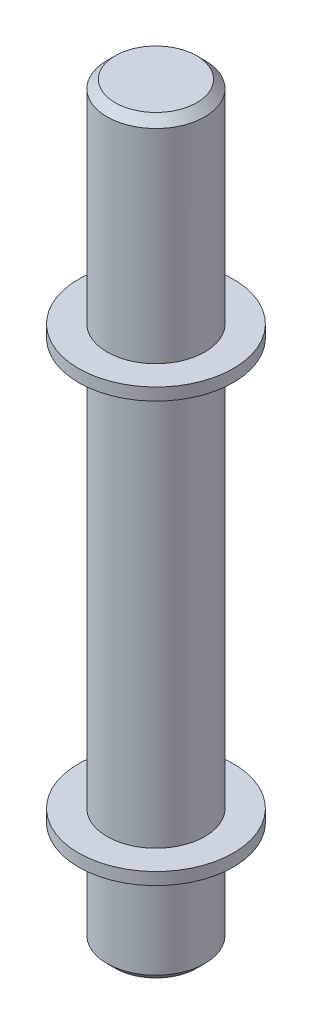
ISO-10303-21;
HEADER;
FILE_DESCRIPTION(('STEP AP214'),'2;1');
FILE_NAME('part.step','',(''),(''),'','','');
FILE_SCHEMA(('AUTOMOTIVE_DESIGN { 1 0 10303 214 1 1 1 1 }'));
ENDSEC;
DATA;
#1=APPLICATION_CONTEXT('core data for automotive mechanical design processes');
#2=APPLICATION_PROTOCOL_DEFINITION('international standard','automotive_design',2000,#1);
#3=PRODUCT_CONTEXT('',#1,'mechanical');
#4=PRODUCT('Part','Part','',(#3));
#5=PRODUCT_RELATED_PRODUCT_CATEGORY('part','',(#4));
#6=PRODUCT_DEFINITION_FORMATION('','',#4);
#7=PRODUCT_DEFINITION_CONTEXT('part definition',#1,'design');
#8=PRODUCT_DEFINITION('design','',#6,#7);
#9=PRODUCT_DEFINITION_SHAPE('','',#8);
#10=(LENGTH_UNIT() NAMED_UNIT(*) SI_UNIT(.MILLI.,.METRE.));
#11=(NAMED_UNIT(*) PLANE_ANGLE_UNIT() SI_UNIT($,.RADIAN.));
#12=(NAMED_UNIT(*) SI_UNIT($,.STERADIAN.) SOLID_ANGLE_UNIT());
#13=UNCERTAINTY_MEASURE_WITH_UNIT(LENGTH_MEASURE(1.E-05),#10,'distance_accuracy_value','');
#14=(GEOMETRIC_REPRESENTATION_CONTEXT(3) GLOBAL_UNCERTAINTY_ASSIGNED_CONTEXT((#13)) GLOBAL_UNIT_ASSIGNED_CONTEXT((#10,
#11,#12)) REPRESENTATION_CONTEXT('',''));
#15=CARTESIAN_POINT('',(0.,0.,0.));
#16=DIRECTION('',(0.,0.,1.));
#17=DIRECTION('',(1.,0.,0.));
#18=AXIS2_PLACEMENT_3D('',#15,#16,#17);
#19=CARTESIAN_POINT('',(0.,0.,0.));
#20=DIRECTION('',(0.,1.,0.));
#21=DIRECTION('',(0.,0.,1.));
#22=AXIS2_PLACEMENT_3D('',#19,#20,#21);
#23=PLANE('',#22);
#24=CARTESIAN_POINT('',(0.,0.,0.));
#25=DIRECTION('',(0.,1.,0.));
#26=DIRECTION('',(0.,0.,1.));
#27=AXIS2_PLACEMENT_3D('',#24,#25,#26);
#28=CIRCLE('',#27,10.);
#29=CARTESIAN_POINT('',(0.,0.,10.));
#30=VERTEX_POINT('',#29);
#31=EDGE_CURVE('E45',#30,#30,#28,.F.);
#32=ORIENTED_EDGE('',*,*,#31,.T.);
#33=EDGE_LOOP('',(#32));
#34=FACE_BOUND('',#33,.T.);
#35=ADVANCED_FACE('F34',(#34),#23,.F.);
#36=CARTESIAN_POINT('',(0.,29.7776081352658,0.));
#37=DIRECTION('',(0.,1.,0.));
#38=DIRECTION('',(0.,0.,1.));
#39=AXIS2_PLACEMENT_3D('',#36,#37,#38);
#40=CYLINDRICAL_SURFACE('',#39,12.);
#41=CARTESIAN_POINT('',(0.,1.99999999999998,0.));
#42=DIRECTION('',(0.,1.,0.));
#43=DIRECTION('',(0.,0.,1.));
#44=AXIS2_PLACEMENT_3D('',#41,#42,#43);
#45=CIRCLE('',#44,12.);
#46=CARTESIAN_POINT('',(0.,1.99999999999998,12.));
#47=VERTEX_POINT('',#46);
#48=EDGE_CURVE('E49',#47,#47,#45,.T.);
#49=ORIENTED_EDGE('',*,*,#48,.T.);
#50=EDGE_LOOP('',(#49));
#51=FACE_BOUND('',#50,.T.);
#52=CARTESIAN_POINT('',(0.,26.,0.));
#53=DIRECTION('',(0.,1.,0.));
#54=DIRECTION('',(0.,0.,1.));
#55=AXIS2_PLACEMENT_3D('',#52,#53,#54);
#56=CIRCLE('',#55,12.);
#57=CARTESIAN_POINT('',(0.,26.,12.));
#58=VERTEX_POINT('',#57);
#59=EDGE_CURVE('E54',#58,#58,#56,.T.);
#60=ORIENTED_EDGE('',*,*,#59,.F.);
#61=EDGE_LOOP('',(#60));
#62=FACE_BOUND('',#61,.T.);
#63=ADVANCED_FACE('F120',(#51,#62),#40,.T.);
#64=CARTESIAN_POINT('',(0.,26.,-12.));
#65=DIRECTION('',(0.,1.,0.));
#66=DIRECTION('',(0.,0.,1.));
#67=AXIS2_PLACEMENT_3D('',#64,#65,#66);
#68=PLANE('',#67);
#69=CARTESIAN_POINT('',(0.,26.,0.));
#70=DIRECTION('',(0.,1.,0.));
#71=DIRECTION('',(0.,0.,1.));
#72=AXIS2_PLACEMENT_3D('',#69,#70,#71);
#73=CIRCLE('',#72,19.);
#74=CARTESIAN_POINT('',(0.,26.,19.));
#75=VERTEX_POINT('',#74);
#76=EDGE_CURVE('E57',#75,#75,#73,.T.);
#77=ORIENTED_EDGE('',*,*,#76,.F.);
#78=EDGE_LOOP('',(#77));
#79=FACE_BOUND('',#78,.T.);
#80=ORIENTED_EDGE('',*,*,#59,.T.);
#81=EDGE_LOOP('',(#80));
#82=FACE_BOUND('',#81,.T.);
#83=ADVANCED_FACE('F114',(#79,#82),#68,.F.);
#84=CARTESIAN_POINT('',(0.,29.7776081352658,0.));
#85=DIRECTION('',(0.,1.,0.));
#86=DIRECTION('',(0.,0.,1.));
#87=AXIS2_PLACEMENT_3D('',#84,#85,#86);
#88=CYLINDRICAL_SURFACE('',#87,19.);
#89=CARTESIAN_POINT('',(0.,29.,0.));
#90=DIRECTION('',(0.,1.,0.));
#91=DIRECTION('',(0.,0.,1.));
#92=AXIS2_PLACEMENT_3D('',#89,#90,#91);
#93=CIRCLE('',#92,19.);
#94=CARTESIAN_POINT('',(0.,29.,19.));
#95=VERTEX_POINT('',#94);
#96=EDGE_CURVE('E60',#95,#95,#93,.T.);
#97=ORIENTED_EDGE('',*,*,#96,.F.);
#98=EDGE_LOOP('',(#97));
#99=FACE_BOUND('',#98,.T.);
#100=ORIENTED_EDGE('',*,*,#76,.T.);
#101=EDGE_LOOP('',(#100));
#102=FACE_BOUND('',#101,.T.);
#103=ADVANCED_FACE('F108',(#99,#102),#88,.T.);
#104=CARTESIAN_POINT('',(0.,29.,-19.));
#105=DIRECTION('',(0.,-1.,0.));
#106=DIRECTION('',(0.,0.,-1.));
#107=AXIS2_PLACEMENT_3D('',#104,#105,#106);
#108=PLANE('',#107);
#109=CARTESIAN_POINT('',(0.,29.,0.));
#110=DIRECTION('',(0.,1.,0.));
#111=DIRECTION('',(0.,0.,1.));
#112=AXIS2_PLACEMENT_3D('',#109,#110,#111);
#113=CIRCLE('',#112,12.);
#114=CARTESIAN_POINT('',(0.,29.,12.));
#115=VERTEX_POINT('',#114);
#116=EDGE_CURVE('E63',#115,#115,#113,.T.);
#117=ORIENTED_EDGE('',*,*,#116,.F.);
#118=EDGE_LOOP('',(#117));
#119=FACE_BOUND('',#118,.T.);
#120=ORIENTED_EDGE('',*,*,#96,.T.);
#121=EDGE_LOOP('',(#120));
#122=FACE_BOUND('',#121,.T.);
#123=ADVANCED_FACE('F102',(#119,#122),#108,.F.);
#124=CARTESIAN_POINT('',(0.,29.7776081352658,0.));
#125=DIRECTION('',(0.,1.,0.));
#126=DIRECTION('',(0.,0.,1.));
#127=AXIS2_PLACEMENT_3D('',#124,#125,#126);
#128=CYLINDRICAL_SURFACE('',#127,12.);
#129=CARTESIAN_POINT('',(0.,129.,0.));
#130=DIRECTION('',(0.,1.,0.));
#131=DIRECTION('',(0.,0.,1.));
#132=AXIS2_PLACEMENT_3D('',#129,#130,#131);
#133=CIRCLE('',#132,12.);
#134=CARTESIAN_POINT('',(0.,129.,12.));
#135=VERTEX_POINT('',#134);
#136=EDGE_CURVE('E66',#135,#135,#133,.T.);
#137=ORIENTED_EDGE('',*,*,#136,.F.);
#138=EDGE_LOOP('',(#137));
#139=FACE_BOUND('',#138,.T.);
#140=ORIENTED_EDGE('',*,*,#116,.T.);
#141=EDGE_LOOP('',(#140));
#142=FACE_BOUND('',#141,.T.);
#143=ADVANCED_FACE('F96',(#139,#142),#128,.T.);
#144=CARTESIAN_POINT('',(0.,129.,-12.));
#145=DIRECTION('',(0.,1.,0.));
#146=DIRECTION('',(0.,0.,1.));
#147=AXIS2_PLACEMENT_3D('',#144,#145,#146);
#148=PLANE('',#147);
#149=CARTESIAN_POINT('',(0.,129.,0.));
#150=DIRECTION('',(0.,1.,0.));
#151=DIRECTION('',(0.,0.,1.));
#152=AXIS2_PLACEMENT_3D('',#149,#150,#151);
#153=CIRCLE('',#152,19.);
#154=CARTESIAN_POINT('',(0.,129.,19.));
#155=VERTEX_POINT('',#154);
#156=EDGE_CURVE('E69',#155,#155,#153,.T.);
#157=ORIENTED_EDGE('',*,*,#156,.F.);
#158=EDGE_LOOP('',(#157));
#159=FACE_BOUND('',#158,.T.);
#160=ORIENTED_EDGE('',*,*,#136,.T.);
#161=EDGE_LOOP('',(#160));
#162=FACE_BOUND('',#161,.T.);
#163=ADVANCED_FACE('F90',(#159,#162),#148,.F.);
#164=CARTESIAN_POINT('',(0.,29.7776081352658,0.));
#165=DIRECTION('',(0.,1.,0.));
#166=DIRECTION('',(0.,0.,1.));
#167=AXIS2_PLACEMENT_3D('',#164,#165,#166);
#168=CYLINDRICAL_SURFACE('',#167,19.);
#169=CARTESIAN_POINT('',(0.,132.,0.));
#170=DIRECTION('',(0.,1.,0.));
#171=DIRECTION('',(0.,0.,1.));
#172=AXIS2_PLACEMENT_3D('',#169,#170,#171);
#173=CIRCLE('',#172,19.);
#174=CARTESIAN_POINT('',(0.,132.,19.));
#175=VERTEX_POINT('',#174);
#176=EDGE_CURVE('E72',#175,#175,#173,.T.);
#177=ORIENTED_EDGE('',*,*,#176,.F.);
#178=EDGE_LOOP('',(#177));
#179=FACE_BOUND('',#178,.T.);
#180=ORIENTED_EDGE('',*,*,#156,.T.);
#181=EDGE_LOOP('',(#180));
#182=FACE_BOUND('',#181,.T.);
#183=ADVANCED_FACE('F84',(#179,#182),#168,.T.);
#184=CARTESIAN_POINT('',(0.,132.,-19.));
#185=DIRECTION('',(0.,-1.,0.));
#186=DIRECTION('',(0.,0.,-1.));
#187=AXIS2_PLACEMENT_3D('',#184,#185,#186);
#188=PLANE('',#187);
#189=CARTESIAN_POINT('',(0.,132.,0.));
#190=DIRECTION('',(0.,1.,0.));
#191=DIRECTION('',(0.,0.,1.));
#192=AXIS2_PLACEMENT_3D('',#189,#190,#191);
#193=CIRCLE('',#192,12.);
#194=CARTESIAN_POINT('',(0.,132.,12.));
#195=VERTEX_POINT('',#194);
#196=EDGE_CURVE('E75',#195,#195,#193,.T.);
#197=ORIENTED_EDGE('',*,*,#196,.F.);
#198=EDGE_LOOP('',(#197));
#199=FACE_BOUND('',#198,.T.);
#200=ORIENTED_EDGE('',*,*,#176,.T.);
#201=EDGE_LOOP('',(#200));
#202=FACE_BOUND('',#201,.T.);
#203=ADVANCED_FACE('F81',(#199,#202),#188,.F.);
#204=CARTESIAN_POINT('',(0.,29.7776081352658,0.));
#205=DIRECTION('',(0.,1.,0.));
#206=DIRECTION('',(0.,0.,1.));
#207=AXIS2_PLACEMENT_3D('',#204,#205,#206);
#208=CYLINDRICAL_SURFACE('',#207,12.);
#209=CARTESIAN_POINT('',(0.,182.,0.));
#210=DIRECTION('',(0.,-1.,0.));
#211=DIRECTION('',(0.,0.,-1.));
#212=AXIS2_PLACEMENT_3D('',#209,#210,#211);
#213=CIRCLE('',#212,12.);
#214=CARTESIAN_POINT('',(0.,182.,-12.));
#215=VERTEX_POINT('',#214);
#216=EDGE_CURVE('E10',#215,#215,#213,.T.);
#217=ORIENTED_EDGE('',*,*,#216,.T.);
#218=EDGE_LOOP('',(#217));
#219=FACE_BOUND('',#218,.T.);
#220=ORIENTED_EDGE('',*,*,#196,.T.);
#221=EDGE_LOOP('',(#220));
#222=FACE_BOUND('',#221,.T.);
#223=ADVANCED_FACE('F79',(#219,#222),#208,.T.);
#224=CARTESIAN_POINT('',(0.,184.,-12.));
#225=DIRECTION('',(0.,-1.,0.));
#226=DIRECTION('',(0.,0.,-1.));
#227=AXIS2_PLACEMENT_3D('',#224,#225,#226);
#228=PLANE('',#227);
#229=CARTESIAN_POINT('',(0.,184.,0.));
#230=DIRECTION('',(0.,-1.,0.));
#231=DIRECTION('',(0.,0.,-1.));
#232=AXIS2_PLACEMENT_3D('',#229,#230,#231);
#233=CIRCLE('',#232,9.99999999999998);
#234=CARTESIAN_POINT('',(0.,184.,-9.99999999999998));
#235=VERTEX_POINT('',#234);
#236=EDGE_CURVE('E41',#235,#235,#233,.F.);
#237=ORIENTED_EDGE('',*,*,#236,.T.);
#238=EDGE_LOOP('',(#237));
#239=FACE_BOUND('',#238,.T.);
#240=ADVANCED_FACE('F134',(#239),#228,.F.);
#241=CARTESIAN_POINT('',(0.,1.99999999999998,0.));
#242=DIRECTION('',(0.,1.,0.));
#243=DIRECTION('',(0.,0.,1.));
#244=AXIS2_PLACEMENT_3D('',#241,#242,#243);
#245=CONICAL_SURFACE('',#244,12.,0.785398163397445);
#246=ORIENTED_EDGE('',*,*,#31,.F.);
#247=EDGE_LOOP('',(#246));
#248=FACE_BOUND('',#247,.T.);
#249=ORIENTED_EDGE('',*,*,#48,.F.);
#250=EDGE_LOOP('',(#249));
#251=FACE_BOUND('',#250,.T.);
#252=ADVANCED_FACE('F132',(#248,#251),#245,.T.);
#253=CARTESIAN_POINT('',(0.,184.,0.));
#254=DIRECTION('',(0.,-1.,0.));
#255=DIRECTION('',(0.,0.,-1.));
#256=AXIS2_PLACEMENT_3D('',#253,#254,#255);
#257=CONICAL_SURFACE('',#256,9.99999999999998,0.785398163397453);
#258=ORIENTED_EDGE('',*,*,#216,.F.);
#259=EDGE_LOOP('',(#258));
#260=FACE_BOUND('',#259,.T.);
#261=ORIENTED_EDGE('',*,*,#236,.F.);
#262=EDGE_LOOP('',(#261));
#263=FACE_BOUND('',#262,.T.);
#264=ADVANCED_FACE('F36',(#260,#263),#257,.T.);
#265=CLOSED_SHELL('',(#35,#63,#83,#103,#123,#143,#163,#183,#203,#223,#240,#252,#264));
#266=MANIFOLD_SOLID_BREP('B2',#265);
#267=ADVANCED_BREP_SHAPE_REPRESENTATION('',(#18,#266),#14);
#268=SHAPE_DEFINITION_REPRESENTATION(#9,#267);
ENDSEC;
END-ISO-10303-21;
